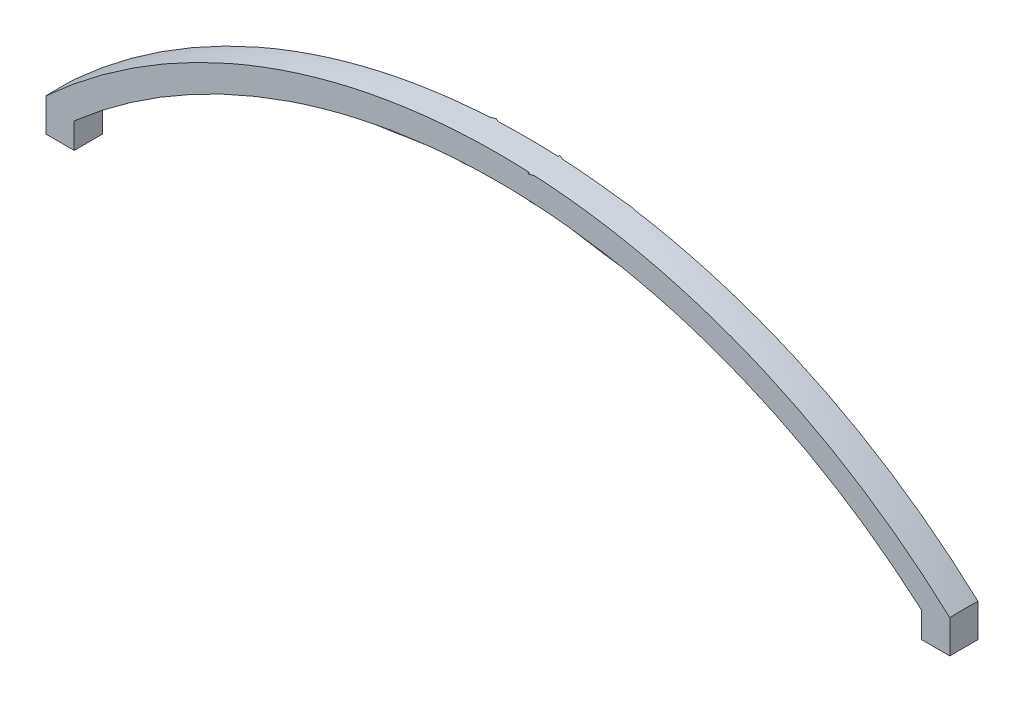
ISO-10303-21;
HEADER;
FILE_DESCRIPTION(('STEP AP214'),'2;1');
FILE_NAME('part.step','',(''),(''),'','','');
FILE_SCHEMA(('AUTOMOTIVE_DESIGN { 1 0 10303 214 1 1 1 1 }'));
ENDSEC;
DATA;
#1=APPLICATION_CONTEXT('core data for automotive mechanical design processes');
#2=APPLICATION_PROTOCOL_DEFINITION('international standard','automotive_design',2000,#1);
#3=PRODUCT_CONTEXT('',#1,'mechanical');
#4=PRODUCT('Part','Part','',(#3));
#5=PRODUCT_RELATED_PRODUCT_CATEGORY('part','',(#4));
#6=PRODUCT_DEFINITION_FORMATION('','',#4);
#7=PRODUCT_DEFINITION_CONTEXT('part definition',#1,'design');
#8=PRODUCT_DEFINITION('design','',#6,#7);
#9=PRODUCT_DEFINITION_SHAPE('','',#8);
#10=(LENGTH_UNIT() NAMED_UNIT(*) SI_UNIT(.MILLI.,.METRE.));
#11=(NAMED_UNIT(*) PLANE_ANGLE_UNIT() SI_UNIT($,.RADIAN.));
#12=(NAMED_UNIT(*) SI_UNIT($,.STERADIAN.) SOLID_ANGLE_UNIT());
#13=UNCERTAINTY_MEASURE_WITH_UNIT(LENGTH_MEASURE(1.E-05),#10,'distance_accuracy_value','');
#14=(GEOMETRIC_REPRESENTATION_CONTEXT(3) GLOBAL_UNCERTAINTY_ASSIGNED_CONTEXT((#13)) GLOBAL_UNIT_ASSIGNED_CONTEXT((#10,
#11,#12)) REPRESENTATION_CONTEXT('',''));
#15=CARTESIAN_POINT('',(0.,0.,0.));
#16=DIRECTION('',(0.,0.,1.));
#17=DIRECTION('',(1.,0.,0.));
#18=AXIS2_PLACEMENT_3D('',#15,#16,#17);
#19=CARTESIAN_POINT('',(0.,0.,0.));
#20=DIRECTION('',(0.,-1.,0.));
#21=DIRECTION('',(-1.,0.,0.));
#22=AXIS2_PLACEMENT_3D('',#19,#20,#21);
#23=SPHERICAL_SURFACE('',#22,355.);
#24=CARTESIAN_POINT('',(0.,0.,-7.5));
#25=DIRECTION('',(0.,0.,-1.));
#26=DIRECTION('',(-1.,0.,0.));
#27=AXIS2_PLACEMENT_3D('',#24,#25,#26);
#28=CIRCLE('',#27,354.920765805553);
#29=CARTESIAN_POINT('',(240.1253469306,261.359078207471,-7.5));
#30=VERTEX_POINT('',#29);
#31=CARTESIAN_POINT('',(-240.1253469306,261.359078207471,-7.5));
#32=VERTEX_POINT('',#31);
#33=EDGE_CURVE('E115',#30,#32,#28,.F.);
#34=ORIENTED_EDGE('',*,*,#33,.T.);
#35=CARTESIAN_POINT('',(-240.1253469306,0.,0.));
#36=DIRECTION('',(1.,0.,0.));
#37=DIRECTION('',(0.,0.,-1.));
#38=AXIS2_PLACEMENT_3D('',#35,#36,#37);
#39=CIRCLE('',#38,261.46666663546);
#40=CARTESIAN_POINT('',(-240.1253469306,261.359078207471,7.5));
#41=VERTEX_POINT('',#40);
#42=EDGE_CURVE('E99',#41,#32,#39,.F.);
#43=ORIENTED_EDGE('',*,*,#42,.F.);
#44=CARTESIAN_POINT('',(0.,0.,7.5));
#45=DIRECTION('',(0.,0.,-1.));
#46=DIRECTION('',(-1.,0.,0.));
#47=AXIS2_PLACEMENT_3D('',#44,#45,#46);
#48=CIRCLE('',#47,354.920765805553);
#49=CARTESIAN_POINT('',(240.1253469306,261.359078207471,7.5));
#50=VERTEX_POINT('',#49);
#51=EDGE_CURVE('E113',#50,#41,#48,.F.);
#52=ORIENTED_EDGE('',*,*,#51,.F.);
#53=CARTESIAN_POINT('',(240.1253469306,0.,0.));
#54=DIRECTION('',(-1.,0.,0.));
#55=DIRECTION('',(0.,0.,1.));
#56=AXIS2_PLACEMENT_3D('',#53,#54,#55);
#57=CIRCLE('',#56,261.46666663546);
#58=EDGE_CURVE('E117',#30,#50,#57,.F.);
#59=ORIENTED_EDGE('',*,*,#58,.F.);
#60=EDGE_LOOP('',(#34,#43,#52,#59));
#61=FACE_BOUND('',#60,.T.);
#62=ADVANCED_FACE('F33',(#61),#23,.T.);
#63=CARTESIAN_POINT('',(0.,0.,0.));
#64=DIRECTION('',(0.,-1.,0.));
#65=DIRECTION('',(-1.,0.,0.));
#66=AXIS2_PLACEMENT_3D('',#63,#64,#65);
#67=SPHERICAL_SURFACE('',#66,342.);
#68=CARTESIAN_POINT('',(0.,0.,-7.5));
#69=DIRECTION('',(0.,0.,-1.));
#70=DIRECTION('',(-1.,0.,0.));
#71=AXIS2_PLACEMENT_3D('',#68,#69,#70);
#72=CIRCLE('',#71,341.917753268239);
#73=CARTESIAN_POINT('',(-225.1253469306,257.344765187437,-7.5));
#74=VERTEX_POINT('',#73);
#75=CARTESIAN_POINT('',(225.1253469306,257.344765187437,-7.5));
#76=VERTEX_POINT('',#75);
#77=EDGE_CURVE('E51',#74,#76,#72,.T.);
#78=ORIENTED_EDGE('',*,*,#77,.T.);
#79=CARTESIAN_POINT('',(0.,257.344765187437,0.));
#80=DIRECTION('',(0.,-1.,0.));
#81=DIRECTION('',(0.,0.,-1.));
#82=AXIS2_PLACEMENT_3D('',#79,#80,#81);
#83=CIRCLE('',#82,225.250242687157);
#84=CARTESIAN_POINT('',(225.1253469306,257.344765187437,7.5));
#85=VERTEX_POINT('',#84);
#86=EDGE_CURVE('E11',#76,#85,#83,.T.);
#87=ORIENTED_EDGE('',*,*,#86,.T.);
#88=CARTESIAN_POINT('',(0.,0.,7.5));
#89=DIRECTION('',(0.,0.,-1.));
#90=DIRECTION('',(-1.,0.,0.));
#91=AXIS2_PLACEMENT_3D('',#88,#89,#90);
#92=CIRCLE('',#91,341.917753268239);
#93=CARTESIAN_POINT('',(-225.1253469306,257.344765187437,7.5));
#94=VERTEX_POINT('',#93);
#95=EDGE_CURVE('E46',#94,#85,#92,.T.);
#96=ORIENTED_EDGE('',*,*,#95,.F.);
#97=EDGE_CURVE('E40',#94,#74,#83,.T.);
#98=ORIENTED_EDGE('',*,*,#97,.T.);
#99=EDGE_LOOP('',(#78,#87,#96,#98));
#100=FACE_BOUND('',#99,.T.);
#101=ADVANCED_FACE('F179',(#100),#67,.F.);
#102=CARTESIAN_POINT('',(0.,355.001,7.5));
#103=DIRECTION('',(0.,0.,-1.));
#104=DIRECTION('',(-1.,0.,0.));
#105=AXIS2_PLACEMENT_3D('',#102,#103,#104);
#106=PLANE('',#105);
#107=ORIENTED_EDGE('',*,*,#51,.T.);
#108=DIRECTION('',(0.,-1.,0.));
#109=VECTOR('',#108,1.);
#110=CARTESIAN_POINT('',(-240.1253469306,257.344765187437,7.5));
#111=LINE('',#110,#109);
#112=CARTESIAN_POINT('',(-240.1253469306,243.717929588826,7.5));
#113=VERTEX_POINT('',#112);
#114=EDGE_CURVE('E95',#41,#113,#111,.T.);
#115=ORIENTED_EDGE('',*,*,#114,.T.);
#116=DIRECTION('',(1.,0.,0.));
#117=VECTOR('',#116,1.);
#118=CARTESIAN_POINT('',(-225.1253469306,243.717929588826,7.5));
#119=LINE('',#118,#117);
#120=CARTESIAN_POINT('',(-225.1253469306,243.717929588826,7.5));
#121=VERTEX_POINT('',#120);
#122=EDGE_CURVE('E107',#113,#121,#119,.T.);
#123=ORIENTED_EDGE('',*,*,#122,.T.);
#124=DIRECTION('',(0.,1.,0.));
#125=VECTOR('',#124,1.);
#126=CARTESIAN_POINT('',(-225.1253469306,257.344765187437,7.5));
#127=LINE('',#126,#125);
#128=EDGE_CURVE('E108',#121,#94,#127,.T.);
#129=ORIENTED_EDGE('',*,*,#128,.T.);
#130=ORIENTED_EDGE('',*,*,#95,.T.);
#131=DIRECTION('',(0.,-1.,0.));
#132=VECTOR('',#131,1.);
#133=CARTESIAN_POINT('',(225.1253469306,257.344765187437,7.5));
#134=LINE('',#133,#132);
#135=CARTESIAN_POINT('',(225.1253469306,243.717929588826,7.5));
#136=VERTEX_POINT('',#135);
#137=EDGE_CURVE('E116',#85,#136,#134,.T.);
#138=ORIENTED_EDGE('',*,*,#137,.T.);
#139=DIRECTION('',(1.,0.,0.));
#140=VECTOR('',#139,1.);
#141=CARTESIAN_POINT('',(225.1253469306,243.717929588826,7.5));
#142=LINE('',#141,#140);
#143=CARTESIAN_POINT('',(240.1253469306,243.717929588826,7.5));
#144=VERTEX_POINT('',#143);
#145=EDGE_CURVE('E162',#136,#144,#142,.T.);
#146=ORIENTED_EDGE('',*,*,#145,.T.);
#147=DIRECTION('',(0.,1.,0.));
#148=VECTOR('',#147,1.);
#149=CARTESIAN_POINT('',(240.1253469306,257.344765187437,7.5));
#150=LINE('',#149,#148);
#151=EDGE_CURVE('E122',#144,#50,#150,.T.);
#152=ORIENTED_EDGE('',*,*,#151,.T.);
#153=EDGE_LOOP('',(#107,#115,#123,#129,#130,#138,#146,#152));
#154=FACE_BOUND('',#153,.T.);
#155=ADVANCED_FACE('F119',(#154),#106,.F.);
#156=CARTESIAN_POINT('',(0.,355.001,-7.5));
#157=DIRECTION('',(0.,0.,-1.));
#158=DIRECTION('',(-1.,0.,0.));
#159=AXIS2_PLACEMENT_3D('',#156,#157,#158);
#160=PLANE('',#159);
#161=DIRECTION('',(0.,-1.,0.));
#162=VECTOR('',#161,1.);
#163=CARTESIAN_POINT('',(-240.1253469306,257.344765187437,-7.5));
#164=LINE('',#163,#162);
#165=CARTESIAN_POINT('',(-240.1253469306,243.717929588826,-7.5));
#166=VERTEX_POINT('',#165);
#167=EDGE_CURVE('E134',#32,#166,#164,.T.);
#168=ORIENTED_EDGE('',*,*,#167,.F.);
#169=ORIENTED_EDGE('',*,*,#33,.F.);
#170=DIRECTION('',(0.,1.,0.));
#171=VECTOR('',#170,1.);
#172=CARTESIAN_POINT('',(240.1253469306,257.344765187437,-7.5));
#173=LINE('',#172,#171);
#174=CARTESIAN_POINT('',(240.1253469306,243.717929588826,-7.5));
#175=VERTEX_POINT('',#174);
#176=EDGE_CURVE('E150',#175,#30,#173,.T.);
#177=ORIENTED_EDGE('',*,*,#176,.F.);
#178=DIRECTION('',(1.,0.,0.));
#179=VECTOR('',#178,1.);
#180=CARTESIAN_POINT('',(225.1253469306,243.717929588826,-7.5));
#181=LINE('',#180,#179);
#182=CARTESIAN_POINT('',(225.1253469306,243.717929588826,-7.5));
#183=VERTEX_POINT('',#182);
#184=EDGE_CURVE('E151',#183,#175,#181,.T.);
#185=ORIENTED_EDGE('',*,*,#184,.F.);
#186=DIRECTION('',(0.,-1.,0.));
#187=VECTOR('',#186,1.);
#188=CARTESIAN_POINT('',(225.1253469306,257.344765187437,-7.5));
#189=LINE('',#188,#187);
#190=EDGE_CURVE('E147',#76,#183,#189,.T.);
#191=ORIENTED_EDGE('',*,*,#190,.F.);
#192=ORIENTED_EDGE('',*,*,#77,.F.);
#193=DIRECTION('',(0.,1.,0.));
#194=VECTOR('',#193,1.);
#195=CARTESIAN_POINT('',(-225.1253469306,257.344765187437,-7.5));
#196=LINE('',#195,#194);
#197=CARTESIAN_POINT('',(-225.1253469306,243.717929588826,-7.5));
#198=VERTEX_POINT('',#197);
#199=EDGE_CURVE('E131',#198,#74,#196,.T.);
#200=ORIENTED_EDGE('',*,*,#199,.F.);
#201=DIRECTION('',(1.,0.,0.));
#202=VECTOR('',#201,1.);
#203=CARTESIAN_POINT('',(-225.1253469306,243.717929588826,-7.5));
#204=LINE('',#203,#202);
#205=EDGE_CURVE('E133',#166,#198,#204,.T.);
#206=ORIENTED_EDGE('',*,*,#205,.F.);
#207=EDGE_LOOP('',(#168,#169,#177,#185,#191,#192,#200,#206));
#208=FACE_BOUND('',#207,.T.);
#209=ADVANCED_FACE('F169',(#208),#160,.T.);
#210=CARTESIAN_POINT('',(-225.1253469306,257.344765187437,-27.7655039027301));
#211=DIRECTION('',(0.,1.,0.));
#212=DIRECTION('',(0.,0.,1.));
#213=AXIS2_PLACEMENT_3D('',#210,#211,#212);
#214=PLANE('',#213);
#215=ORIENTED_EDGE('',*,*,#97,.F.);
#216=DIRECTION('',(0.,0.,1.));
#217=VECTOR('',#216,1.);
#218=CARTESIAN_POINT('',(-225.1253469306,257.344765187437,-27.7655039027301));
#219=LINE('',#218,#217);
#220=EDGE_CURVE('E125',#74,#94,#219,.T.);
#221=ORIENTED_EDGE('',*,*,#220,.F.);
#222=EDGE_LOOP('',(#215,#221));
#223=FACE_BOUND('',#222,.T.);
#224=ADVANCED_FACE('F178',(#223),#214,.T.);
#225=CARTESIAN_POINT('',(-240.1253469306,257.344765187437,-27.7655039027301));
#226=DIRECTION('',(-1.,0.,0.));
#227=DIRECTION('',(0.,0.,1.));
#228=AXIS2_PLACEMENT_3D('',#225,#226,#227);
#229=PLANE('',#228);
#230=ORIENTED_EDGE('',*,*,#114,.F.);
#231=ORIENTED_EDGE('',*,*,#42,.T.);
#232=ORIENTED_EDGE('',*,*,#167,.T.);
#233=DIRECTION('',(0.,0.,1.));
#234=VECTOR('',#233,1.);
#235=CARTESIAN_POINT('',(-240.1253469306,243.717929588826,-27.7655039027301));
#236=LINE('',#235,#234);
#237=EDGE_CURVE('E102',#166,#113,#236,.T.);
#238=ORIENTED_EDGE('',*,*,#237,.T.);
#239=EDGE_LOOP('',(#230,#231,#232,#238));
#240=FACE_BOUND('',#239,.T.);
#241=ADVANCED_FACE('F97',(#240),#229,.T.);
#242=CARTESIAN_POINT('',(-225.1253469306,243.717929588826,-27.7655039027301));
#243=DIRECTION('',(0.,-1.,0.));
#244=DIRECTION('',(0.,0.,-1.));
#245=AXIS2_PLACEMENT_3D('',#242,#243,#244);
#246=PLANE('',#245);
#247=ORIENTED_EDGE('',*,*,#237,.F.);
#248=ORIENTED_EDGE('',*,*,#205,.T.);
#249=DIRECTION('',(0.,0.,1.));
#250=VECTOR('',#249,1.);
#251=CARTESIAN_POINT('',(-225.1253469306,243.717929588826,-27.7655039027301));
#252=LINE('',#251,#250);
#253=EDGE_CURVE('E135',#198,#121,#252,.T.);
#254=ORIENTED_EDGE('',*,*,#253,.T.);
#255=ORIENTED_EDGE('',*,*,#122,.F.);
#256=EDGE_LOOP('',(#247,#248,#254,#255));
#257=FACE_BOUND('',#256,.T.);
#258=ADVANCED_FACE('F172',(#257),#246,.T.);
#259=CARTESIAN_POINT('',(-225.1253469306,257.344765187437,-27.7655039027301));
#260=DIRECTION('',(1.,0.,0.));
#261=DIRECTION('',(0.,0.,-1.));
#262=AXIS2_PLACEMENT_3D('',#259,#260,#261);
#263=PLANE('',#262);
#264=ORIENTED_EDGE('',*,*,#253,.F.);
#265=ORIENTED_EDGE('',*,*,#199,.T.);
#266=ORIENTED_EDGE('',*,*,#220,.T.);
#267=ORIENTED_EDGE('',*,*,#128,.F.);
#268=EDGE_LOOP('',(#264,#265,#266,#267));
#269=FACE_BOUND('',#268,.T.);
#270=ADVANCED_FACE('F175',(#269),#263,.T.);
#271=CARTESIAN_POINT('',(225.1253469306,257.344765187437,-27.7655039027301));
#272=DIRECTION('',(0.,1.,0.));
#273=DIRECTION('',(0.,0.,1.));
#274=AXIS2_PLACEMENT_3D('',#271,#272,#273);
#275=PLANE('',#274);
#276=ORIENTED_EDGE('',*,*,#86,.F.);
#277=DIRECTION('',(0.,0.,1.));
#278=VECTOR('',#277,1.);
#279=CARTESIAN_POINT('',(225.1253469306,257.344765187437,-27.7655039027301));
#280=LINE('',#279,#278);
#281=EDGE_CURVE('E152',#76,#85,#280,.T.);
#282=ORIENTED_EDGE('',*,*,#281,.T.);
#283=EDGE_LOOP('',(#276,#282));
#284=FACE_BOUND('',#283,.T.);
#285=ADVANCED_FACE('F187',(#284),#275,.T.);
#286=CARTESIAN_POINT('',(225.1253469306,243.717929588826,-27.7655039027301));
#287=DIRECTION('',(0.,-1.,0.));
#288=DIRECTION('',(0.,0.,-1.));
#289=AXIS2_PLACEMENT_3D('',#286,#287,#288);
#290=PLANE('',#289);
#291=DIRECTION('',(0.,0.,1.));
#292=VECTOR('',#291,1.);
#293=CARTESIAN_POINT('',(225.1253469306,243.717929588826,-27.7655039027301));
#294=LINE('',#293,#292);
#295=EDGE_CURVE('E143',#183,#136,#294,.T.);
#296=ORIENTED_EDGE('',*,*,#295,.F.);
#297=ORIENTED_EDGE('',*,*,#184,.T.);
#298=DIRECTION('',(0.,0.,1.));
#299=VECTOR('',#298,1.);
#300=CARTESIAN_POINT('',(240.1253469306,243.717929588826,-27.7655039027301));
#301=LINE('',#300,#299);
#302=EDGE_CURVE('E148',#175,#144,#301,.T.);
#303=ORIENTED_EDGE('',*,*,#302,.T.);
#304=ORIENTED_EDGE('',*,*,#145,.F.);
#305=EDGE_LOOP('',(#296,#297,#303,#304));
#306=FACE_BOUND('',#305,.T.);
#307=ADVANCED_FACE('F189',(#306),#290,.T.);
#308=CARTESIAN_POINT('',(240.1253469306,257.344765187437,-27.7655039027301));
#309=DIRECTION('',(1.,0.,0.));
#310=DIRECTION('',(0.,0.,-1.));
#311=AXIS2_PLACEMENT_3D('',#308,#309,#310);
#312=PLANE('',#311);
#313=ORIENTED_EDGE('',*,*,#302,.F.);
#314=ORIENTED_EDGE('',*,*,#176,.T.);
#315=ORIENTED_EDGE('',*,*,#58,.T.);
#316=ORIENTED_EDGE('',*,*,#151,.F.);
#317=EDGE_LOOP('',(#313,#314,#315,#316));
#318=FACE_BOUND('',#317,.T.);
#319=ADVANCED_FACE('F167',(#318),#312,.T.);
#320=CARTESIAN_POINT('',(225.1253469306,257.344765187437,-27.7655039027301));
#321=DIRECTION('',(-1.,0.,0.));
#322=DIRECTION('',(0.,0.,1.));
#323=AXIS2_PLACEMENT_3D('',#320,#321,#322);
#324=PLANE('',#323);
#325=ORIENTED_EDGE('',*,*,#281,.F.);
#326=ORIENTED_EDGE('',*,*,#190,.T.);
#327=ORIENTED_EDGE('',*,*,#295,.T.);
#328=ORIENTED_EDGE('',*,*,#137,.F.);
#329=EDGE_LOOP('',(#325,#326,#327,#328));
#330=FACE_BOUND('',#329,.T.);
#331=ADVANCED_FACE('F185',(#330),#324,.T.);
#332=CLOSED_SHELL('',(#62,#101,#155,#209,#224,#241,#258,#270,#285,#307,#319,#331));
#333=MANIFOLD_SOLID_BREP('B2',#332);
#334=ADVANCED_BREP_SHAPE_REPRESENTATION('',(#18,#333),#14);
#335=SHAPE_DEFINITION_REPRESENTATION(#9,#334);
ENDSEC;
END-ISO-10303-21;
